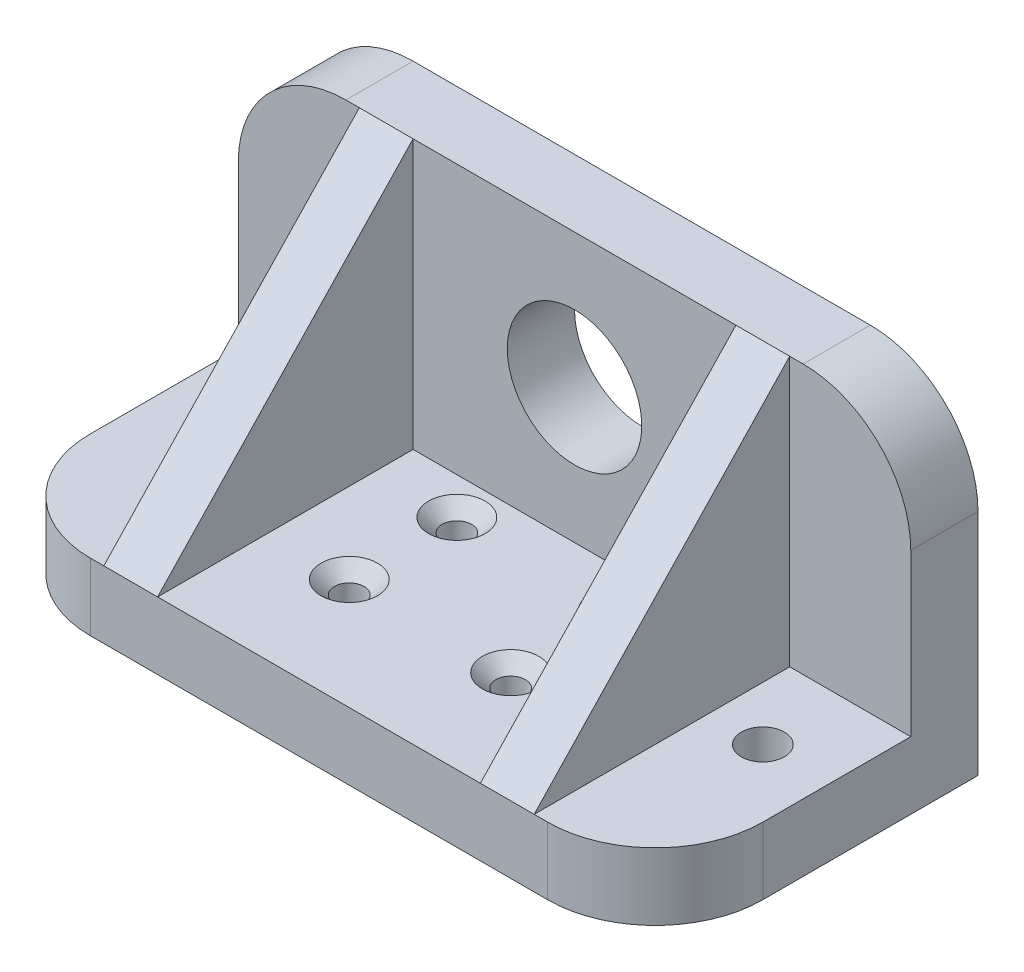
ISO-10303-21;
HEADER;
FILE_DESCRIPTION(('STEP AP214'),'2;1');
FILE_NAME('part.step','',(''),(''),'','','');
FILE_SCHEMA(('AUTOMOTIVE_DESIGN { 1 0 10303 214 1 1 1 1 }'));
ENDSEC;
DATA;
#1=APPLICATION_CONTEXT('core data for automotive mechanical design processes');
#2=APPLICATION_PROTOCOL_DEFINITION('international standard','automotive_design',2000,#1);
#3=PRODUCT_CONTEXT('',#1,'mechanical');
#4=PRODUCT('Part','Part','',(#3));
#5=PRODUCT_RELATED_PRODUCT_CATEGORY('part','',(#4));
#6=PRODUCT_DEFINITION_FORMATION('','',#4);
#7=PRODUCT_DEFINITION_CONTEXT('part definition',#1,'design');
#8=PRODUCT_DEFINITION('design','',#6,#7);
#9=PRODUCT_DEFINITION_SHAPE('','',#8);
#10=(LENGTH_UNIT() NAMED_UNIT(*) SI_UNIT(.MILLI.,.METRE.));
#11=(NAMED_UNIT(*) PLANE_ANGLE_UNIT() SI_UNIT($,.RADIAN.));
#12=(NAMED_UNIT(*) SI_UNIT($,.STERADIAN.) SOLID_ANGLE_UNIT());
#13=UNCERTAINTY_MEASURE_WITH_UNIT(LENGTH_MEASURE(1.E-05),#10,'distance_accuracy_value','');
#14=(GEOMETRIC_REPRESENTATION_CONTEXT(3) GLOBAL_UNCERTAINTY_ASSIGNED_CONTEXT((#13)) GLOBAL_UNIT_ASSIGNED_CONTEXT((#10,
#11,#12)) REPRESENTATION_CONTEXT('',''));
#15=CARTESIAN_POINT('',(0.,0.,0.));
#16=DIRECTION('',(0.,0.,1.));
#17=DIRECTION('',(1.,0.,0.));
#18=AXIS2_PLACEMENT_3D('',#15,#16,#17);
#19=CARTESIAN_POINT('',(0.,5.,0.));
#20=DIRECTION('',(0.,-1.,0.));
#21=DIRECTION('',(0.,0.,-1.));
#22=AXIS2_PLACEMENT_3D('',#19,#20,#21);
#23=PLANE('',#22);
#24=CARTESIAN_POINT('',(20.,5.,-0.999999999999996));
#25=DIRECTION('',(0.,1.,0.));
#26=DIRECTION('',(0.,0.,1.));
#27=AXIS2_PLACEMENT_3D('',#24,#25,#26);
#28=CIRCLE('',#27,1.6);
#29=CARTESIAN_POINT('',(20.,5.,0.600000000000006));
#30=VERTEX_POINT('',#29);
#31=EDGE_CURVE('E417',#30,#30,#28,.T.);
#32=ORIENTED_EDGE('',*,*,#31,.F.);
#33=EDGE_LOOP('',(#32));
#34=FACE_BOUND('',#33,.T.);
#35=DIRECTION('',(1.,0.,0.));
#36=VECTOR('',#35,1.);
#37=CARTESIAN_POINT('',(-25.,5.,12.));
#38=LINE('',#37,#36);
#39=CARTESIAN_POINT('',(16.,5.,12.));
#40=VERTEX_POINT('',#39);
#41=CARTESIAN_POINT('',(17.,5.,12.));
#42=VERTEX_POINT('',#41);
#43=EDGE_CURVE('E211',#40,#42,#38,.T.);
#44=ORIENTED_EDGE('',*,*,#43,.T.);
#45=CARTESIAN_POINT('',(17.,5.,4.));
#46=DIRECTION('',(0.,-1.,0.));
#47=DIRECTION('',(0.,0.,-1.));
#48=AXIS2_PLACEMENT_3D('',#45,#46,#47);
#49=CIRCLE('',#48,8.);
#50=CARTESIAN_POINT('',(25.,5.,4.));
#51=VERTEX_POINT('',#50);
#52=EDGE_CURVE('E246',#42,#51,#49,.F.);
#53=ORIENTED_EDGE('',*,*,#52,.T.);
#54=DIRECTION('',(0.,0.,-1.));
#55=VECTOR('',#54,1.);
#56=CARTESIAN_POINT('',(25.,5.,12.));
#57=LINE('',#56,#55);
#58=CARTESIAN_POINT('',(25.,5.,-7.));
#59=VERTEX_POINT('',#58);
#60=EDGE_CURVE('E205',#51,#59,#57,.T.);
#61=ORIENTED_EDGE('',*,*,#60,.T.);
#62=DIRECTION('',(1.,0.,0.));
#63=VECTOR('',#62,1.);
#64=CARTESIAN_POINT('',(-25.,5.,-7.));
#65=LINE('',#64,#63);
#66=CARTESIAN_POINT('',(16.,5.,-7.));
#67=VERTEX_POINT('',#66);
#68=EDGE_CURVE('E191',#67,#59,#65,.T.);
#69=ORIENTED_EDGE('',*,*,#68,.F.);
#70=DIRECTION('',(0.,0.,-1.));
#71=VECTOR('',#70,1.);
#72=CARTESIAN_POINT('',(16.,5.,-7.));
#73=LINE('',#72,#71);
#74=EDGE_CURVE('E358',#40,#67,#73,.T.);
#75=ORIENTED_EDGE('',*,*,#74,.F.);
#76=EDGE_LOOP('',(#44,#53,#61,#69,#75));
#77=FACE_BOUND('',#76,.T.);
#78=ADVANCED_FACE('F36',(#34,#77),#23,.F.);
#79=CARTESIAN_POINT('',(6.,5.,3.75));
#80=DIRECTION('',(0.,-1.,0.));
#81=DIRECTION('',(0.,0.,-1.));
#82=AXIS2_PLACEMENT_3D('',#79,#80,#81);
#83=CIRCLE('',#82,2.09999999999999);
#84=CARTESIAN_POINT('',(6.,5.,1.65000000000001));
#85=VERTEX_POINT('',#84);
#86=EDGE_CURVE('E276',#85,#85,#83,.T.);
#87=ORIENTED_EDGE('',*,*,#86,.T.);
#88=EDGE_LOOP('',(#87));
#89=FACE_BOUND('',#88,.T.);
#90=CARTESIAN_POINT('',(-6.,5.,3.75));
#91=DIRECTION('',(0.,-1.,0.));
#92=DIRECTION('',(0.,0.,-1.));
#93=AXIS2_PLACEMENT_3D('',#90,#91,#92);
#94=CIRCLE('',#93,2.10000000000003);
#95=CARTESIAN_POINT('',(-6.,5.,1.64999999999997));
#96=VERTEX_POINT('',#95);
#97=EDGE_CURVE('E273',#96,#96,#94,.T.);
#98=ORIENTED_EDGE('',*,*,#97,.T.);
#99=EDGE_LOOP('',(#98));
#100=FACE_BOUND('',#99,.T.);
#101=CARTESIAN_POINT('',(6.,5.,-4.25));
#102=DIRECTION('',(0.,-1.,0.));
#103=DIRECTION('',(0.,0.,-1.));
#104=AXIS2_PLACEMENT_3D('',#101,#102,#103);
#105=CIRCLE('',#104,2.10000000000001);
#106=CARTESIAN_POINT('',(6.,5.,-6.35000000000001));
#107=VERTEX_POINT('',#106);
#108=EDGE_CURVE('E270',#107,#107,#105,.T.);
#109=ORIENTED_EDGE('',*,*,#108,.T.);
#110=EDGE_LOOP('',(#109));
#111=FACE_BOUND('',#110,.T.);
#112=CARTESIAN_POINT('',(-6.,5.,-4.25));
#113=DIRECTION('',(0.,-1.,0.));
#114=DIRECTION('',(0.,0.,-1.));
#115=AXIS2_PLACEMENT_3D('',#112,#113,#114);
#116=CIRCLE('',#115,2.10000000000003);
#117=CARTESIAN_POINT('',(-6.,5.,-6.35000000000003));
#118=VERTEX_POINT('',#117);
#119=EDGE_CURVE('E267',#118,#118,#116,.T.);
#120=ORIENTED_EDGE('',*,*,#119,.T.);
#121=EDGE_LOOP('',(#120));
#122=FACE_BOUND('',#121,.T.);
#123=DIRECTION('',(0.,0.,1.));
#124=VECTOR('',#123,1.);
#125=CARTESIAN_POINT('',(12.,5.,-7.));
#126=LINE('',#125,#124);
#127=CARTESIAN_POINT('',(12.,5.,-7.));
#128=VERTEX_POINT('',#127);
#129=CARTESIAN_POINT('',(12.,5.,12.));
#130=VERTEX_POINT('',#129);
#131=EDGE_CURVE('E367',#128,#130,#126,.T.);
#132=ORIENTED_EDGE('',*,*,#131,.F.);
#133=CARTESIAN_POINT('',(-12.,5.,-7.));
#134=VERTEX_POINT('',#133);
#135=EDGE_CURVE('E199',#134,#128,#65,.T.);
#136=ORIENTED_EDGE('',*,*,#135,.F.);
#137=DIRECTION('',(0.,0.,-1.));
#138=VECTOR('',#137,1.);
#139=CARTESIAN_POINT('',(-12.,5.,-7.));
#140=LINE('',#139,#138);
#141=CARTESIAN_POINT('',(-12.,5.,12.));
#142=VERTEX_POINT('',#141);
#143=EDGE_CURVE('E188',#142,#134,#140,.T.);
#144=ORIENTED_EDGE('',*,*,#143,.F.);
#145=EDGE_CURVE('E215',#142,#130,#38,.T.);
#146=ORIENTED_EDGE('',*,*,#145,.T.);
#147=EDGE_LOOP('',(#132,#136,#144,#146));
#148=FACE_BOUND('',#147,.T.);
#149=ADVANCED_FACE('F301',(#89,#100,#111,#122,#148),#23,.F.);
#150=CARTESIAN_POINT('',(-25.,25.,-7.));
#151=DIRECTION('',(0.,0.,-1.));
#152=DIRECTION('',(-1.,0.,0.));
#153=AXIS2_PLACEMENT_3D('',#150,#151,#152);
#154=PLANE('',#153);
#155=DIRECTION('',(0.,-1.,0.));
#156=VECTOR('',#155,1.);
#157=CARTESIAN_POINT('',(25.,25.,-7.));
#158=LINE('',#157,#156);
#159=CARTESIAN_POINT('',(25.,17.,-7.));
#160=VERTEX_POINT('',#159);
#161=EDGE_CURVE('E197',#160,#59,#158,.T.);
#162=ORIENTED_EDGE('',*,*,#161,.F.);
#163=CARTESIAN_POINT('',(17.,17.,-7.));
#164=DIRECTION('',(0.,0.,-1.));
#165=DIRECTION('',(-1.,0.,0.));
#166=AXIS2_PLACEMENT_3D('',#163,#164,#165);
#167=CIRCLE('',#166,8.);
#168=CARTESIAN_POINT('',(17.,25.,-7.));
#169=VERTEX_POINT('',#168);
#170=EDGE_CURVE('E262',#160,#169,#167,.F.);
#171=ORIENTED_EDGE('',*,*,#170,.T.);
#172=DIRECTION('',(1.,0.,0.));
#173=VECTOR('',#172,1.);
#174=CARTESIAN_POINT('',(-25.,25.,-7.));
#175=LINE('',#174,#173);
#176=CARTESIAN_POINT('',(16.,25.,-7.));
#177=VERTEX_POINT('',#176);
#178=EDGE_CURVE('E164',#177,#169,#175,.T.);
#179=ORIENTED_EDGE('',*,*,#178,.F.);
#180=DIRECTION('',(0.,-1.,0.));
#181=VECTOR('',#180,1.);
#182=CARTESIAN_POINT('',(16.,25.,-7.));
#183=LINE('',#182,#181);
#184=EDGE_CURVE('E380',#177,#67,#183,.T.);
#185=ORIENTED_EDGE('',*,*,#184,.T.);
#186=ORIENTED_EDGE('',*,*,#68,.T.);
#187=EDGE_LOOP('',(#162,#171,#179,#185,#186));
#188=FACE_BOUND('',#187,.T.);
#189=ADVANCED_FACE('F308',(#188),#154,.F.);
#190=CARTESIAN_POINT('',(0.,15.,-7.));
#191=DIRECTION('',(0.,0.,-1.));
#192=DIRECTION('',(-1.,0.,0.));
#193=AXIS2_PLACEMENT_3D('',#190,#191,#192);
#194=CIRCLE('',#193,5.);
#195=CARTESIAN_POINT('',(-5.,15.,-7.));
#196=VERTEX_POINT('',#195);
#197=EDGE_CURVE('E406',#196,#196,#194,.T.);
#198=ORIENTED_EDGE('',*,*,#197,.T.);
#199=EDGE_LOOP('',(#198));
#200=FACE_BOUND('',#199,.T.);
#201=DIRECTION('',(0.,-1.,0.));
#202=VECTOR('',#201,1.);
#203=CARTESIAN_POINT('',(12.,25.,-7.));
#204=LINE('',#203,#202);
#205=CARTESIAN_POINT('',(12.,25.,-7.));
#206=VERTEX_POINT('',#205);
#207=EDGE_CURVE('E378',#206,#128,#204,.T.);
#208=ORIENTED_EDGE('',*,*,#207,.F.);
#209=CARTESIAN_POINT('',(-12.,25.,-7.));
#210=VERTEX_POINT('',#209);
#211=EDGE_CURVE('E162',#210,#206,#175,.T.);
#212=ORIENTED_EDGE('',*,*,#211,.F.);
#213=DIRECTION('',(0.,-1.,0.));
#214=VECTOR('',#213,1.);
#215=CARTESIAN_POINT('',(-12.,25.,-7.));
#216=LINE('',#215,#214);
#217=EDGE_CURVE('E187',#210,#134,#216,.T.);
#218=ORIENTED_EDGE('',*,*,#217,.T.);
#219=ORIENTED_EDGE('',*,*,#135,.T.);
#220=EDGE_LOOP('',(#208,#212,#218,#219));
#221=FACE_BOUND('',#220,.T.);
#222=ADVANCED_FACE('F315',(#200,#221),#154,.F.);
#223=CARTESIAN_POINT('',(-20.,5.,-0.999999999999991));
#224=DIRECTION('',(0.,1.,0.));
#225=DIRECTION('',(0.,0.,-1.));
#226=AXIS2_PLACEMENT_3D('',#223,#224,#225);
#227=CIRCLE('',#226,1.6);
#228=CARTESIAN_POINT('',(-20.,5.,-2.59999999999999));
#229=VERTEX_POINT('',#228);
#230=EDGE_CURVE('E326',#229,#229,#227,.T.);
#231=ORIENTED_EDGE('',*,*,#230,.F.);
#232=EDGE_LOOP('',(#231));
#233=FACE_BOUND('',#232,.T.);
#234=DIRECTION('',(0.,0.,1.));
#235=VECTOR('',#234,1.);
#236=CARTESIAN_POINT('',(-25.,5.,12.));
#237=LINE('',#236,#235);
#238=CARTESIAN_POINT('',(-25.,5.,-7.));
#239=VERTEX_POINT('',#238);
#240=CARTESIAN_POINT('',(-25.,5.,4.));
#241=VERTEX_POINT('',#240);
#242=EDGE_CURVE('E207',#239,#241,#237,.T.);
#243=ORIENTED_EDGE('',*,*,#242,.T.);
#244=CARTESIAN_POINT('',(-17.,5.,4.));
#245=DIRECTION('',(0.,-1.,0.));
#246=DIRECTION('',(0.,0.,-1.));
#247=AXIS2_PLACEMENT_3D('',#244,#245,#246);
#248=CIRCLE('',#247,8.);
#249=CARTESIAN_POINT('',(-17.,5.,12.));
#250=VERTEX_POINT('',#249);
#251=EDGE_CURVE('E252',#241,#250,#248,.F.);
#252=ORIENTED_EDGE('',*,*,#251,.T.);
#253=CARTESIAN_POINT('',(-16.,5.,12.));
#254=VERTEX_POINT('',#253);
#255=EDGE_CURVE('E212',#250,#254,#38,.T.);
#256=ORIENTED_EDGE('',*,*,#255,.T.);
#257=DIRECTION('',(0.,0.,1.));
#258=VECTOR('',#257,1.);
#259=CARTESIAN_POINT('',(-16.,5.,-7.));
#260=LINE('',#259,#258);
#261=CARTESIAN_POINT('',(-16.,5.,-7.));
#262=VERTEX_POINT('',#261);
#263=EDGE_CURVE('E180',#262,#254,#260,.T.);
#264=ORIENTED_EDGE('',*,*,#263,.F.);
#265=EDGE_CURVE('E186',#239,#262,#65,.T.);
#266=ORIENTED_EDGE('',*,*,#265,.F.);
#267=EDGE_LOOP('',(#243,#252,#256,#264,#266));
#268=FACE_BOUND('',#267,.T.);
#269=ADVANCED_FACE('F304',(#233,#268),#23,.F.);
#270=CARTESIAN_POINT('',(-17.,25.,-7.));
#271=VERTEX_POINT('',#270);
#272=CARTESIAN_POINT('',(-16.,25.,-7.));
#273=VERTEX_POINT('',#272);
#274=EDGE_CURVE('E152',#271,#273,#175,.T.);
#275=ORIENTED_EDGE('',*,*,#274,.F.);
#276=CARTESIAN_POINT('',(-17.,17.,-7.));
#277=DIRECTION('',(0.,0.,-1.));
#278=DIRECTION('',(-1.,0.,0.));
#279=AXIS2_PLACEMENT_3D('',#276,#277,#278);
#280=CIRCLE('',#279,8.);
#281=CARTESIAN_POINT('',(-25.,17.,-7.));
#282=VERTEX_POINT('',#281);
#283=EDGE_CURVE('E51',#271,#282,#280,.F.);
#284=ORIENTED_EDGE('',*,*,#283,.T.);
#285=DIRECTION('',(0.,-1.,0.));
#286=VECTOR('',#285,1.);
#287=CARTESIAN_POINT('',(-25.,25.,-7.));
#288=LINE('',#287,#286);
#289=EDGE_CURVE('E202',#282,#239,#288,.T.);
#290=ORIENTED_EDGE('',*,*,#289,.T.);
#291=ORIENTED_EDGE('',*,*,#265,.T.);
#292=DIRECTION('',(0.,-1.,0.));
#293=VECTOR('',#292,1.);
#294=CARTESIAN_POINT('',(-16.,25.,-7.));
#295=LINE('',#294,#293);
#296=EDGE_CURVE('E178',#273,#262,#295,.T.);
#297=ORIENTED_EDGE('',*,*,#296,.F.);
#298=EDGE_LOOP('',(#275,#284,#290,#291,#297));
#299=FACE_BOUND('',#298,.T.);
#300=ADVANCED_FACE('F184',(#299),#154,.F.);
#301=CARTESIAN_POINT('',(25.,5.,12.));
#302=DIRECTION('',(-1.,0.,0.));
#303=DIRECTION('',(0.,0.,1.));
#304=AXIS2_PLACEMENT_3D('',#301,#302,#303);
#305=PLANE('',#304);
#306=ORIENTED_EDGE('',*,*,#60,.F.);
#307=DIRECTION('',(0.,-1.,0.));
#308=VECTOR('',#307,1.);
#309=CARTESIAN_POINT('',(25.,5.,4.));
#310=LINE('',#309,#308);
#311=CARTESIAN_POINT('',(25.,0.,4.));
#312=VERTEX_POINT('',#311);
#313=EDGE_CURVE('E234',#51,#312,#310,.T.);
#314=ORIENTED_EDGE('',*,*,#313,.T.);
#315=DIRECTION('',(0.,0.,-1.));
#316=VECTOR('',#315,1.);
#317=CARTESIAN_POINT('',(25.,0.,12.));
#318=LINE('',#317,#316);
#319=CARTESIAN_POINT('',(25.,0.,-12.));
#320=VERTEX_POINT('',#319);
#321=EDGE_CURVE('E204',#312,#320,#318,.T.);
#322=ORIENTED_EDGE('',*,*,#321,.T.);
#323=DIRECTION('',(0.,-1.,0.));
#324=VECTOR('',#323,1.);
#325=CARTESIAN_POINT('',(25.,5.,-12.));
#326=LINE('',#325,#324);
#327=CARTESIAN_POINT('',(25.,17.,-12.));
#328=VERTEX_POINT('',#327);
#329=EDGE_CURVE('E227',#328,#320,#326,.T.);
#330=ORIENTED_EDGE('',*,*,#329,.F.);
#331=DIRECTION('',(0.,0.,-1.));
#332=VECTOR('',#331,1.);
#333=CARTESIAN_POINT('',(25.,17.,-7.));
#334=LINE('',#333,#332);
#335=EDGE_CURVE('E232',#328,#160,#334,.F.);
#336=ORIENTED_EDGE('',*,*,#335,.T.);
#337=ORIENTED_EDGE('',*,*,#161,.T.);
#338=EDGE_LOOP('',(#306,#314,#322,#330,#336,#337));
#339=FACE_BOUND('',#338,.T.);
#340=ADVANCED_FACE('F321',(#339),#305,.F.);
#341=CARTESIAN_POINT('',(-25.,5.,-12.));
#342=DIRECTION('',(0.,0.,1.));
#343=DIRECTION('',(1.,0.,0.));
#344=AXIS2_PLACEMENT_3D('',#341,#342,#343);
#345=PLANE('',#344);
#346=CARTESIAN_POINT('',(0.,15.,-12.));
#347=DIRECTION('',(0.,0.,-1.));
#348=DIRECTION('',(-1.,0.,0.));
#349=AXIS2_PLACEMENT_3D('',#346,#347,#348);
#350=CIRCLE('',#349,5.);
#351=CARTESIAN_POINT('',(-5.,15.,-12.));
#352=VERTEX_POINT('',#351);
#353=EDGE_CURVE('E409',#352,#352,#350,.T.);
#354=ORIENTED_EDGE('',*,*,#353,.F.);
#355=EDGE_LOOP('',(#354));
#356=FACE_BOUND('',#355,.T.);
#357=DIRECTION('',(0.,-1.,0.));
#358=VECTOR('',#357,1.);
#359=CARTESIAN_POINT('',(-25.,5.,-12.));
#360=LINE('',#359,#358);
#361=CARTESIAN_POINT('',(-25.,17.,-12.));
#362=VERTEX_POINT('',#361);
#363=CARTESIAN_POINT('',(-25.,0.,-12.));
#364=VERTEX_POINT('',#363);
#365=EDGE_CURVE('E214',#362,#364,#360,.T.);
#366=ORIENTED_EDGE('',*,*,#365,.F.);
#367=CARTESIAN_POINT('',(-17.,17.,-12.));
#368=DIRECTION('',(0.,0.,1.));
#369=DIRECTION('',(1.,0.,0.));
#370=AXIS2_PLACEMENT_3D('',#367,#368,#369);
#371=CIRCLE('',#370,8.);
#372=CARTESIAN_POINT('',(-17.,25.,-12.));
#373=VERTEX_POINT('',#372);
#374=EDGE_CURVE('E59',#362,#373,#371,.F.);
#375=ORIENTED_EDGE('',*,*,#374,.T.);
#376=DIRECTION('',(-1.,0.,0.));
#377=VECTOR('',#376,1.);
#378=CARTESIAN_POINT('',(-25.,25.,-12.));
#379=LINE('',#378,#377);
#380=CARTESIAN_POINT('',(17.,25.,-12.));
#381=VERTEX_POINT('',#380);
#382=EDGE_CURVE('E161',#381,#373,#379,.T.);
#383=ORIENTED_EDGE('',*,*,#382,.F.);
#384=CARTESIAN_POINT('',(17.,17.,-12.));
#385=DIRECTION('',(0.,0.,1.));
#386=DIRECTION('',(1.,0.,0.));
#387=AXIS2_PLACEMENT_3D('',#384,#385,#386);
#388=CIRCLE('',#387,8.);
#389=EDGE_CURVE('E259',#381,#328,#388,.F.);
#390=ORIENTED_EDGE('',*,*,#389,.T.);
#391=ORIENTED_EDGE('',*,*,#329,.T.);
#392=DIRECTION('',(-1.,0.,0.));
#393=VECTOR('',#392,1.);
#394=CARTESIAN_POINT('',(-25.,0.,-12.));
#395=LINE('',#394,#393);
#396=EDGE_CURVE('E218',#320,#364,#395,.T.);
#397=ORIENTED_EDGE('',*,*,#396,.T.);
#398=EDGE_LOOP('',(#366,#375,#383,#390,#391,#397));
#399=FACE_BOUND('',#398,.T.);
#400=ADVANCED_FACE('F481',(#356,#399),#345,.F.);
#401=CARTESIAN_POINT('',(-25.,5.,12.));
#402=DIRECTION('',(1.,0.,0.));
#403=DIRECTION('',(0.,0.,-1.));
#404=AXIS2_PLACEMENT_3D('',#401,#402,#403);
#405=PLANE('',#404);
#406=DIRECTION('',(0.,0.,1.));
#407=VECTOR('',#406,1.);
#408=CARTESIAN_POINT('',(-25.,0.,12.));
#409=LINE('',#408,#407);
#410=CARTESIAN_POINT('',(-25.,0.,4.));
#411=VERTEX_POINT('',#410);
#412=EDGE_CURVE('E221',#364,#411,#409,.T.);
#413=ORIENTED_EDGE('',*,*,#412,.T.);
#414=DIRECTION('',(0.,-1.,0.));
#415=VECTOR('',#414,1.);
#416=CARTESIAN_POINT('',(-25.,5.,4.));
#417=LINE('',#416,#415);
#418=EDGE_CURVE('E250',#411,#241,#417,.F.);
#419=ORIENTED_EDGE('',*,*,#418,.T.);
#420=ORIENTED_EDGE('',*,*,#242,.F.);
#421=ORIENTED_EDGE('',*,*,#289,.F.);
#422=DIRECTION('',(0.,0.,1.));
#423=VECTOR('',#422,1.);
#424=CARTESIAN_POINT('',(-25.,17.,-12.));
#425=LINE('',#424,#423);
#426=EDGE_CURVE('E248',#282,#362,#425,.F.);
#427=ORIENTED_EDGE('',*,*,#426,.T.);
#428=ORIENTED_EDGE('',*,*,#365,.T.);
#429=EDGE_LOOP('',(#413,#419,#420,#421,#427,#428));
#430=FACE_BOUND('',#429,.T.);
#431=ADVANCED_FACE('F476',(#430),#405,.F.);
#432=CARTESIAN_POINT('',(-25.,5.,12.));
#433=DIRECTION('',(0.,0.,-1.));
#434=DIRECTION('',(-1.,0.,0.));
#435=AXIS2_PLACEMENT_3D('',#432,#433,#434);
#436=PLANE('',#435);
#437=DIRECTION('',(1.,0.,0.));
#438=VECTOR('',#437,1.);
#439=CARTESIAN_POINT('',(-25.,0.,12.));
#440=LINE('',#439,#438);
#441=CARTESIAN_POINT('',(-17.,0.,12.));
#442=VERTEX_POINT('',#441);
#443=CARTESIAN_POINT('',(17.,0.,12.));
#444=VERTEX_POINT('',#443);
#445=EDGE_CURVE('E208',#442,#444,#440,.T.);
#446=ORIENTED_EDGE('',*,*,#445,.T.);
#447=DIRECTION('',(0.,-1.,0.));
#448=VECTOR('',#447,1.);
#449=CARTESIAN_POINT('',(17.,5.,12.));
#450=LINE('',#449,#448);
#451=EDGE_CURVE('E244',#444,#42,#450,.F.);
#452=ORIENTED_EDGE('',*,*,#451,.T.);
#453=ORIENTED_EDGE('',*,*,#43,.F.);
#454=DIRECTION('',(-1.,0.,0.));
#455=VECTOR('',#454,1.);
#456=CARTESIAN_POINT('',(25.,5.,12.));
#457=LINE('',#456,#455);
#458=EDGE_CURVE('E370',#40,#130,#457,.T.);
#459=ORIENTED_EDGE('',*,*,#458,.T.);
#460=ORIENTED_EDGE('',*,*,#145,.F.);
#461=EDGE_CURVE('E369',#142,#254,#457,.T.);
#462=ORIENTED_EDGE('',*,*,#461,.T.);
#463=ORIENTED_EDGE('',*,*,#255,.F.);
#464=DIRECTION('',(0.,-1.,0.));
#465=VECTOR('',#464,1.);
#466=CARTESIAN_POINT('',(-17.,5.,12.));
#467=LINE('',#466,#465);
#468=EDGE_CURVE('E241',#250,#442,#467,.T.);
#469=ORIENTED_EDGE('',*,*,#468,.T.);
#470=EDGE_LOOP('',(#446,#452,#453,#459,#460,#462,#463,#469));
#471=FACE_BOUND('',#470,.T.);
#472=ADVANCED_FACE('F338',(#471),#436,.F.);
#473=CARTESIAN_POINT('',(0.,0.,0.));
#474=DIRECTION('',(0.,-1.,0.));
#475=DIRECTION('',(0.,0.,-1.));
#476=AXIS2_PLACEMENT_3D('',#473,#474,#475);
#477=PLANE('',#476);
#478=CARTESIAN_POINT('',(20.,0.,-0.999999999999996));
#479=DIRECTION('',(0.,1.,0.));
#480=DIRECTION('',(0.,0.,1.));
#481=AXIS2_PLACEMENT_3D('',#478,#479,#480);
#482=CIRCLE('',#481,1.6);
#483=CARTESIAN_POINT('',(20.,0.,0.600000000000006));
#484=VERTEX_POINT('',#483);
#485=EDGE_CURVE('E412',#484,#484,#482,.T.);
#486=ORIENTED_EDGE('',*,*,#485,.T.);
#487=EDGE_LOOP('',(#486));
#488=FACE_BOUND('',#487,.T.);
#489=CARTESIAN_POINT('',(-20.,0.,-0.999999999999991));
#490=DIRECTION('',(0.,1.,0.));
#491=DIRECTION('',(0.,0.,-1.));
#492=AXIS2_PLACEMENT_3D('',#489,#490,#491);
#493=CIRCLE('',#492,1.6);
#494=CARTESIAN_POINT('',(-20.,0.,-2.59999999999999));
#495=VERTEX_POINT('',#494);
#496=EDGE_CURVE('E414',#495,#495,#493,.T.);
#497=ORIENTED_EDGE('',*,*,#496,.T.);
#498=EDGE_LOOP('',(#497));
#499=FACE_BOUND('',#498,.T.);
#500=CARTESIAN_POINT('',(6.,0.,3.75));
#501=DIRECTION('',(0.,1.,0.));
#502=DIRECTION('',(0.,0.,1.));
#503=AXIS2_PLACEMENT_3D('',#500,#501,#502);
#504=CIRCLE('',#503,1.1);
#505=CARTESIAN_POINT('',(6.,0.,4.85));
#506=VERTEX_POINT('',#505);
#507=EDGE_CURVE('E397',#506,#506,#504,.T.);
#508=ORIENTED_EDGE('',*,*,#507,.T.);
#509=EDGE_LOOP('',(#508));
#510=FACE_BOUND('',#509,.T.);
#511=CARTESIAN_POINT('',(-6.,0.,-4.25));
#512=DIRECTION('',(0.,1.,0.));
#513=DIRECTION('',(0.,0.,-1.));
#514=AXIS2_PLACEMENT_3D('',#511,#512,#513);
#515=CIRCLE('',#514,1.10000000000002);
#516=CARTESIAN_POINT('',(-6.,0.,-5.35000000000002));
#517=VERTEX_POINT('',#516);
#518=EDGE_CURVE('E398',#517,#517,#515,.T.);
#519=ORIENTED_EDGE('',*,*,#518,.T.);
#520=EDGE_LOOP('',(#519));
#521=FACE_BOUND('',#520,.T.);
#522=CARTESIAN_POINT('',(-6.,0.,3.75));
#523=DIRECTION('',(0.,1.,0.));
#524=DIRECTION('',(0.,0.,-1.));
#525=AXIS2_PLACEMENT_3D('',#522,#523,#524);
#526=CIRCLE('',#525,1.10000000000002);
#527=CARTESIAN_POINT('',(-6.,0.,2.64999999999999));
#528=VERTEX_POINT('',#527);
#529=EDGE_CURVE('E401',#528,#528,#526,.T.);
#530=ORIENTED_EDGE('',*,*,#529,.T.);
#531=EDGE_LOOP('',(#530));
#532=FACE_BOUND('',#531,.T.);
#533=CARTESIAN_POINT('',(6.,0.,-4.25));
#534=DIRECTION('',(0.,1.,0.));
#535=DIRECTION('',(0.,0.,1.));
#536=AXIS2_PLACEMENT_3D('',#533,#534,#535);
#537=CIRCLE('',#536,1.1);
#538=CARTESIAN_POINT('',(6.,0.,-3.15));
#539=VERTEX_POINT('',#538);
#540=EDGE_CURVE('E181',#539,#539,#537,.T.);
#541=ORIENTED_EDGE('',*,*,#540,.T.);
#542=EDGE_LOOP('',(#541));
#543=FACE_BOUND('',#542,.T.);
#544=ORIENTED_EDGE('',*,*,#321,.F.);
#545=CARTESIAN_POINT('',(17.,0.,4.));
#546=DIRECTION('',(0.,-1.,0.));
#547=DIRECTION('',(0.,0.,-1.));
#548=AXIS2_PLACEMENT_3D('',#545,#546,#547);
#549=CIRCLE('',#548,8.);
#550=EDGE_CURVE('E239',#312,#444,#549,.T.);
#551=ORIENTED_EDGE('',*,*,#550,.T.);
#552=ORIENTED_EDGE('',*,*,#445,.F.);
#553=CARTESIAN_POINT('',(-17.,0.,4.));
#554=DIRECTION('',(0.,-1.,0.));
#555=DIRECTION('',(0.,0.,-1.));
#556=AXIS2_PLACEMENT_3D('',#553,#554,#555);
#557=CIRCLE('',#556,8.);
#558=EDGE_CURVE('E237',#442,#411,#557,.T.);
#559=ORIENTED_EDGE('',*,*,#558,.T.);
#560=ORIENTED_EDGE('',*,*,#412,.F.);
#561=ORIENTED_EDGE('',*,*,#396,.F.);
#562=EDGE_LOOP('',(#544,#551,#552,#559,#560,#561));
#563=FACE_BOUND('',#562,.T.);
#564=ADVANCED_FACE('F342',(#488,#499,#510,#521,#532,#543,#563),#477,.T.);
#565=CARTESIAN_POINT('',(0.,25.,0.));
#566=DIRECTION('',(0.,1.,0.));
#567=DIRECTION('',(0.,0.,1.));
#568=AXIS2_PLACEMENT_3D('',#565,#566,#567);
#569=PLANE('',#568);
#570=ORIENTED_EDGE('',*,*,#382,.T.);
#571=DIRECTION('',(0.,0.,1.));
#572=VECTOR('',#571,1.);
#573=CARTESIAN_POINT('',(-17.,25.,-7.));
#574=LINE('',#573,#572);
#575=EDGE_CURVE('E158',#373,#271,#574,.T.);
#576=ORIENTED_EDGE('',*,*,#575,.T.);
#577=ORIENTED_EDGE('',*,*,#274,.T.);
#578=DIRECTION('',(-1.,0.,0.));
#579=VECTOR('',#578,1.);
#580=CARTESIAN_POINT('',(25.,25.,-7.));
#581=LINE('',#580,#579);
#582=EDGE_CURVE('E156',#210,#273,#581,.T.);
#583=ORIENTED_EDGE('',*,*,#582,.F.);
#584=ORIENTED_EDGE('',*,*,#211,.T.);
#585=EDGE_CURVE('E173',#177,#206,#581,.T.);
#586=ORIENTED_EDGE('',*,*,#585,.F.);
#587=ORIENTED_EDGE('',*,*,#178,.T.);
#588=DIRECTION('',(0.,0.,-1.));
#589=VECTOR('',#588,1.);
#590=CARTESIAN_POINT('',(17.,25.,-12.));
#591=LINE('',#590,#589);
#592=EDGE_CURVE('E254',#169,#381,#591,.T.);
#593=ORIENTED_EDGE('',*,*,#592,.T.);
#594=EDGE_LOOP('',(#570,#576,#577,#583,#584,#586,#587,#593));
#595=FACE_BOUND('',#594,.T.);
#596=ADVANCED_FACE('F154',(#595),#569,.T.);
#597=CARTESIAN_POINT('',(-16.,25.,-7.));
#598=DIRECTION('',(1.,0.,0.));
#599=DIRECTION('',(0.,0.,-1.));
#600=AXIS2_PLACEMENT_3D('',#597,#598,#599);
#601=PLANE('',#600);
#602=ORIENTED_EDGE('',*,*,#263,.T.);
#603=DIRECTION('',(0.,-0.724999433594414,0.688749461914693));
#604=VECTOR('',#603,1.);
#605=CARTESIAN_POINT('',(-16.,25.,-7.));
#606=LINE('',#605,#604);
#607=EDGE_CURVE('E169',#273,#254,#606,.T.);
#608=ORIENTED_EDGE('',*,*,#607,.F.);
#609=ORIENTED_EDGE('',*,*,#296,.T.);
#610=EDGE_LOOP('',(#602,#608,#609));
#611=FACE_BOUND('',#610,.T.);
#612=ADVANCED_FACE('F177',(#611),#601,.F.);
#613=CARTESIAN_POINT('',(-12.,25.,-7.));
#614=DIRECTION('',(-1.,0.,0.));
#615=DIRECTION('',(0.,0.,1.));
#616=AXIS2_PLACEMENT_3D('',#613,#614,#615);
#617=PLANE('',#616);
#618=ORIENTED_EDGE('',*,*,#217,.F.);
#619=DIRECTION('',(0.,-0.724999433594414,0.688749461914693));
#620=VECTOR('',#619,1.);
#621=CARTESIAN_POINT('',(-12.,25.,-7.));
#622=LINE('',#621,#620);
#623=EDGE_CURVE('E172',#210,#142,#622,.T.);
#624=ORIENTED_EDGE('',*,*,#623,.T.);
#625=ORIENTED_EDGE('',*,*,#143,.T.);
#626=EDGE_LOOP('',(#618,#624,#625));
#627=FACE_BOUND('',#626,.T.);
#628=ADVANCED_FACE('F463',(#627),#617,.F.);
#629=CARTESIAN_POINT('',(16.,25.,-7.));
#630=DIRECTION('',(-1.,0.,0.));
#631=DIRECTION('',(0.,0.,1.));
#632=AXIS2_PLACEMENT_3D('',#629,#630,#631);
#633=PLANE('',#632);
#634=ORIENTED_EDGE('',*,*,#184,.F.);
#635=DIRECTION('',(0.,-0.724999433594414,0.688749461914693));
#636=VECTOR('',#635,1.);
#637=CARTESIAN_POINT('',(16.,25.,-7.));
#638=LINE('',#637,#636);
#639=EDGE_CURVE('E373',#177,#40,#638,.T.);
#640=ORIENTED_EDGE('',*,*,#639,.T.);
#641=ORIENTED_EDGE('',*,*,#74,.T.);
#642=EDGE_LOOP('',(#634,#640,#641));
#643=FACE_BOUND('',#642,.T.);
#644=ADVANCED_FACE('F391',(#643),#633,.F.);
#645=CARTESIAN_POINT('',(12.,25.,-7.));
#646=DIRECTION('',(1.,0.,0.));
#647=DIRECTION('',(0.,0.,-1.));
#648=AXIS2_PLACEMENT_3D('',#645,#646,#647);
#649=PLANE('',#648);
#650=ORIENTED_EDGE('',*,*,#131,.T.);
#651=DIRECTION('',(0.,0.724999433594414,-0.688749461914693));
#652=VECTOR('',#651,1.);
#653=CARTESIAN_POINT('',(12.,25.,-7.));
#654=LINE('',#653,#652);
#655=EDGE_CURVE('E229',#130,#206,#654,.T.);
#656=ORIENTED_EDGE('',*,*,#655,.T.);
#657=ORIENTED_EDGE('',*,*,#207,.T.);
#658=EDGE_LOOP('',(#650,#656,#657));
#659=FACE_BOUND('',#658,.T.);
#660=ADVANCED_FACE('F376',(#659),#649,.F.);
#661=CARTESIAN_POINT('',(25.,25.,-7.));
#662=DIRECTION('',(0.,-0.688749461914693,-0.724999433594414));
#663=DIRECTION('',(0.,0.724999433594414,-0.688749461914693));
#664=AXIS2_PLACEMENT_3D('',#661,#662,#663);
#665=PLANE('',#664);
#666=ORIENTED_EDGE('',*,*,#585,.T.);
#667=ORIENTED_EDGE('',*,*,#655,.F.);
#668=ORIENTED_EDGE('',*,*,#458,.F.);
#669=ORIENTED_EDGE('',*,*,#639,.F.);
#670=EDGE_LOOP('',(#666,#667,#668,#669));
#671=FACE_BOUND('',#670,.T.);
#672=ADVANCED_FACE('F458',(#671),#665,.F.);
#673=ORIENTED_EDGE('',*,*,#582,.T.);
#674=ORIENTED_EDGE('',*,*,#607,.T.);
#675=ORIENTED_EDGE('',*,*,#461,.F.);
#676=ORIENTED_EDGE('',*,*,#623,.F.);
#677=EDGE_LOOP('',(#673,#674,#675,#676));
#678=FACE_BOUND('',#677,.T.);
#679=ADVANCED_FACE('F168',(#678),#665,.F.);
#680=CARTESIAN_POINT('',(6.,0.,-4.25));
#681=DIRECTION('',(0.,1.,0.));
#682=DIRECTION('',(0.,0.,1.));
#683=AXIS2_PLACEMENT_3D('',#680,#681,#682);
#684=CYLINDRICAL_SURFACE('',#683,1.1);
#685=CARTESIAN_POINT('',(6.,3.99999999999999,-4.25));
#686=DIRECTION('',(0.,-1.,0.));
#687=DIRECTION('',(0.,0.,-1.));
#688=AXIS2_PLACEMENT_3D('',#685,#686,#687);
#689=CIRCLE('',#688,1.1);
#690=CARTESIAN_POINT('',(6.,3.99999999999999,-5.35));
#691=VERTEX_POINT('',#690);
#692=EDGE_CURVE('E44',#691,#691,#689,.F.);
#693=ORIENTED_EDGE('',*,*,#692,.T.);
#694=EDGE_LOOP('',(#693));
#695=FACE_BOUND('',#694,.T.);
#696=ORIENTED_EDGE('',*,*,#540,.F.);
#697=EDGE_LOOP('',(#696));
#698=FACE_BOUND('',#697,.T.);
#699=ADVANCED_FACE('F284',(#695,#698),#684,.F.);
#700=CARTESIAN_POINT('',(-6.,0.,3.75));
#701=DIRECTION('',(0.,1.,0.));
#702=DIRECTION('',(0.,0.,1.));
#703=AXIS2_PLACEMENT_3D('',#700,#701,#702);
#704=CYLINDRICAL_SURFACE('',#703,1.10000000000002);
#705=CARTESIAN_POINT('',(-6.,3.99999999999999,3.75));
#706=DIRECTION('',(0.,-1.,0.));
#707=DIRECTION('',(0.,0.,-1.));
#708=AXIS2_PLACEMENT_3D('',#705,#706,#707);
#709=CIRCLE('',#708,1.10000000000002);
#710=CARTESIAN_POINT('',(-6.,3.99999999999999,2.64999999999999));
#711=VERTEX_POINT('',#710);
#712=EDGE_CURVE('E279',#711,#711,#709,.F.);
#713=ORIENTED_EDGE('',*,*,#712,.T.);
#714=EDGE_LOOP('',(#713));
#715=FACE_BOUND('',#714,.T.);
#716=ORIENTED_EDGE('',*,*,#529,.F.);
#717=EDGE_LOOP('',(#716));
#718=FACE_BOUND('',#717,.T.);
#719=ADVANCED_FACE('F443',(#715,#718),#704,.F.);
#720=CARTESIAN_POINT('',(-6.,0.,-4.25));
#721=DIRECTION('',(0.,1.,0.));
#722=DIRECTION('',(0.,0.,1.));
#723=AXIS2_PLACEMENT_3D('',#720,#721,#722);
#724=CYLINDRICAL_SURFACE('',#723,1.10000000000002);
#725=CARTESIAN_POINT('',(-6.,4.,-4.25));
#726=DIRECTION('',(0.,-1.,0.));
#727=DIRECTION('',(0.,0.,-1.));
#728=AXIS2_PLACEMENT_3D('',#725,#726,#727);
#729=CIRCLE('',#728,1.10000000000002);
#730=CARTESIAN_POINT('',(-6.,4.,-5.35000000000002));
#731=VERTEX_POINT('',#730);
#732=EDGE_CURVE('E11',#731,#731,#729,.F.);
#733=ORIENTED_EDGE('',*,*,#732,.T.);
#734=EDGE_LOOP('',(#733));
#735=FACE_BOUND('',#734,.T.);
#736=ORIENTED_EDGE('',*,*,#518,.F.);
#737=EDGE_LOOP('',(#736));
#738=FACE_BOUND('',#737,.T.);
#739=ADVANCED_FACE('F446',(#735,#738),#724,.F.);
#740=CARTESIAN_POINT('',(6.,0.,3.75));
#741=DIRECTION('',(0.,1.,0.));
#742=DIRECTION('',(0.,0.,1.));
#743=AXIS2_PLACEMENT_3D('',#740,#741,#742);
#744=CYLINDRICAL_SURFACE('',#743,1.1);
#745=CARTESIAN_POINT('',(6.,4.00000000000001,3.75));
#746=DIRECTION('',(0.,-1.,0.));
#747=DIRECTION('',(0.,0.,-1.));
#748=AXIS2_PLACEMENT_3D('',#745,#746,#747);
#749=CIRCLE('',#748,1.1);
#750=CARTESIAN_POINT('',(6.,4.00000000000001,2.65));
#751=VERTEX_POINT('',#750);
#752=EDGE_CURVE('E264',#751,#751,#749,.F.);
#753=ORIENTED_EDGE('',*,*,#752,.T.);
#754=EDGE_LOOP('',(#753));
#755=FACE_BOUND('',#754,.T.);
#756=ORIENTED_EDGE('',*,*,#507,.F.);
#757=EDGE_LOOP('',(#756));
#758=FACE_BOUND('',#757,.T.);
#759=ADVANCED_FACE('F441',(#755,#758),#744,.F.);
#760=CARTESIAN_POINT('',(0.,15.,12.));
#761=DIRECTION('',(0.,0.,-1.));
#762=DIRECTION('',(-1.,0.,0.));
#763=AXIS2_PLACEMENT_3D('',#760,#761,#762);
#764=CYLINDRICAL_SURFACE('',#763,5.);
#765=ORIENTED_EDGE('',*,*,#353,.T.);
#766=EDGE_LOOP('',(#765));
#767=FACE_BOUND('',#766,.T.);
#768=ORIENTED_EDGE('',*,*,#197,.F.);
#769=EDGE_LOOP('',(#768));
#770=FACE_BOUND('',#769,.T.);
#771=ADVANCED_FACE('F435',(#767,#770),#764,.F.);
#772=CARTESIAN_POINT('',(-20.,0.,-0.999999999999991));
#773=DIRECTION('',(0.,1.,0.));
#774=DIRECTION('',(0.,0.,1.));
#775=AXIS2_PLACEMENT_3D('',#772,#773,#774);
#776=CYLINDRICAL_SURFACE('',#775,1.6);
#777=ORIENTED_EDGE('',*,*,#496,.F.);
#778=EDGE_LOOP('',(#777));
#779=FACE_BOUND('',#778,.T.);
#780=ORIENTED_EDGE('',*,*,#230,.T.);
#781=EDGE_LOOP('',(#780));
#782=FACE_BOUND('',#781,.T.);
#783=ADVANCED_FACE('F428',(#779,#782),#776,.F.);
#784=CARTESIAN_POINT('',(20.,0.,-0.999999999999996));
#785=DIRECTION('',(0.,1.,0.));
#786=DIRECTION('',(0.,0.,1.));
#787=AXIS2_PLACEMENT_3D('',#784,#785,#786);
#788=CYLINDRICAL_SURFACE('',#787,1.6);
#789=ORIENTED_EDGE('',*,*,#485,.F.);
#790=EDGE_LOOP('',(#789));
#791=FACE_BOUND('',#790,.T.);
#792=ORIENTED_EDGE('',*,*,#31,.T.);
#793=EDGE_LOOP('',(#792));
#794=FACE_BOUND('',#793,.T.);
#795=ADVANCED_FACE('F425',(#791,#794),#788,.F.);
#796=CARTESIAN_POINT('',(17.,5.,4.));
#797=DIRECTION('',(0.,-1.,0.));
#798=DIRECTION('',(0.,0.,-1.));
#799=AXIS2_PLACEMENT_3D('',#796,#797,#798);
#800=CYLINDRICAL_SURFACE('',#799,8.);
#801=ORIENTED_EDGE('',*,*,#52,.F.);
#802=ORIENTED_EDGE('',*,*,#451,.F.);
#803=ORIENTED_EDGE('',*,*,#550,.F.);
#804=ORIENTED_EDGE('',*,*,#313,.F.);
#805=EDGE_LOOP('',(#801,#802,#803,#804));
#806=FACE_BOUND('',#805,.T.);
#807=ADVANCED_FACE('F348',(#806),#800,.T.);
#808=CARTESIAN_POINT('',(-17.,5.,4.));
#809=DIRECTION('',(0.,-1.,0.));
#810=DIRECTION('',(0.,0.,-1.));
#811=AXIS2_PLACEMENT_3D('',#808,#809,#810);
#812=CYLINDRICAL_SURFACE('',#811,8.);
#813=ORIENTED_EDGE('',*,*,#251,.F.);
#814=ORIENTED_EDGE('',*,*,#418,.F.);
#815=ORIENTED_EDGE('',*,*,#558,.F.);
#816=ORIENTED_EDGE('',*,*,#468,.F.);
#817=EDGE_LOOP('',(#813,#814,#815,#816));
#818=FACE_BOUND('',#817,.T.);
#819=ADVANCED_FACE('F335',(#818),#812,.T.);
#820=CARTESIAN_POINT('',(-17.,17.,0.));
#821=DIRECTION('',(0.,0.,-1.));
#822=DIRECTION('',(-1.,0.,0.));
#823=AXIS2_PLACEMENT_3D('',#820,#821,#822);
#824=CYLINDRICAL_SURFACE('',#823,8.);
#825=ORIENTED_EDGE('',*,*,#374,.F.);
#826=ORIENTED_EDGE('',*,*,#426,.F.);
#827=ORIENTED_EDGE('',*,*,#283,.F.);
#828=ORIENTED_EDGE('',*,*,#575,.F.);
#829=EDGE_LOOP('',(#825,#826,#827,#828));
#830=FACE_BOUND('',#829,.T.);
#831=ADVANCED_FACE('F489',(#830),#824,.T.);
#832=CARTESIAN_POINT('',(17.,17.,0.));
#833=DIRECTION('',(0.,0.,1.));
#834=DIRECTION('',(1.,0.,0.));
#835=AXIS2_PLACEMENT_3D('',#832,#833,#834);
#836=CYLINDRICAL_SURFACE('',#835,8.);
#837=ORIENTED_EDGE('',*,*,#170,.F.);
#838=ORIENTED_EDGE('',*,*,#335,.F.);
#839=ORIENTED_EDGE('',*,*,#389,.F.);
#840=ORIENTED_EDGE('',*,*,#592,.F.);
#841=EDGE_LOOP('',(#837,#838,#839,#840));
#842=FACE_BOUND('',#841,.T.);
#843=ADVANCED_FACE('F492',(#842),#836,.T.);
#844=CARTESIAN_POINT('',(6.,4.00000000000001,3.75));
#845=DIRECTION('',(0.,1.,0.));
#846=DIRECTION('',(0.,0.,1.));
#847=AXIS2_PLACEMENT_3D('',#844,#845,#846);
#848=CONICAL_SURFACE('',#847,1.1,0.78539816339745);
#849=ORIENTED_EDGE('',*,*,#86,.F.);
#850=EDGE_LOOP('',(#849));
#851=FACE_BOUND('',#850,.T.);
#852=ORIENTED_EDGE('',*,*,#752,.F.);
#853=EDGE_LOOP('',(#852));
#854=FACE_BOUND('',#853,.T.);
#855=ADVANCED_FACE('F296',(#851,#854),#848,.F.);
#856=CARTESIAN_POINT('',(-6.,3.99999999999999,3.75));
#857=DIRECTION('',(0.,1.,0.));
#858=DIRECTION('',(0.,0.,1.));
#859=AXIS2_PLACEMENT_3D('',#856,#857,#858);
#860=CONICAL_SURFACE('',#859,1.10000000000002,0.785398163397454);
#861=ORIENTED_EDGE('',*,*,#97,.F.);
#862=EDGE_LOOP('',(#861));
#863=FACE_BOUND('',#862,.T.);
#864=ORIENTED_EDGE('',*,*,#712,.F.);
#865=EDGE_LOOP('',(#864));
#866=FACE_BOUND('',#865,.T.);
#867=ADVANCED_FACE('F289',(#863,#866),#860,.F.);
#868=CARTESIAN_POINT('',(6.,3.99999999999999,-4.25));
#869=DIRECTION('',(0.,1.,0.));
#870=DIRECTION('',(0.,0.,1.));
#871=AXIS2_PLACEMENT_3D('',#868,#869,#870);
#872=CONICAL_SURFACE('',#871,1.1,0.78539816339745);
#873=ORIENTED_EDGE('',*,*,#108,.F.);
#874=EDGE_LOOP('',(#873));
#875=FACE_BOUND('',#874,.T.);
#876=ORIENTED_EDGE('',*,*,#692,.F.);
#877=EDGE_LOOP('',(#876));
#878=FACE_BOUND('',#877,.T.);
#879=ADVANCED_FACE('F287',(#875,#878),#872,.F.);
#880=CARTESIAN_POINT('',(-6.,4.,-4.25));
#881=DIRECTION('',(0.,1.,0.));
#882=DIRECTION('',(0.,0.,1.));
#883=AXIS2_PLACEMENT_3D('',#880,#881,#882);
#884=CONICAL_SURFACE('',#883,1.10000000000002,0.785398163397453);
#885=ORIENTED_EDGE('',*,*,#119,.F.);
#886=EDGE_LOOP('',(#885));
#887=FACE_BOUND('',#886,.T.);
#888=ORIENTED_EDGE('',*,*,#732,.F.);
#889=EDGE_LOOP('',(#888));
#890=FACE_BOUND('',#889,.T.);
#891=ADVANCED_FACE('F38',(#887,#890),#884,.F.);
#892=CLOSED_SHELL('',(#78,#149,#189,#222,#269,#300,#340,#400,#431,#472,#564,#596,#612,#628,#644,
#660,#672,#679,#699,#719,#739,#759,#771,#783,#795,#807,#819,#831,#843,#855,#867,#879,#891));
#893=MANIFOLD_SOLID_BREP('B2',#892);
#894=ADVANCED_BREP_SHAPE_REPRESENTATION('',(#18,#893),#14);
#895=SHAPE_DEFINITION_REPRESENTATION(#9,#894);
ENDSEC;
END-ISO-10303-21;
